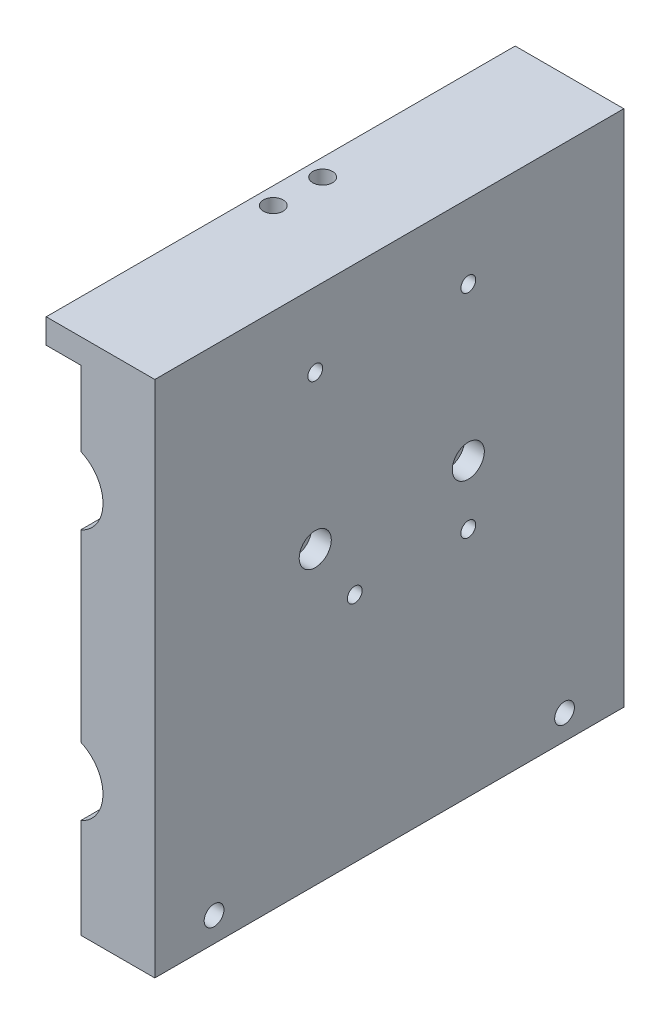
ISO-10303-21;
HEADER;
FILE_DESCRIPTION(('STEP AP214'),'2;1');
FILE_NAME('part.step','',(''),(''),'','','');
FILE_SCHEMA(('AUTOMOTIVE_DESIGN { 1 0 10303 214 1 1 1 1 }'));
ENDSEC;
DATA;
#1=APPLICATION_CONTEXT('core data for automotive mechanical design processes');
#2=APPLICATION_PROTOCOL_DEFINITION('international standard','automotive_design',2000,#1);
#3=PRODUCT_CONTEXT('',#1,'mechanical');
#4=PRODUCT('Part','Part','',(#3));
#5=PRODUCT_RELATED_PRODUCT_CATEGORY('part','',(#4));
#6=PRODUCT_DEFINITION_FORMATION('','',#4);
#7=PRODUCT_DEFINITION_CONTEXT('part definition',#1,'design');
#8=PRODUCT_DEFINITION('design','',#6,#7);
#9=PRODUCT_DEFINITION_SHAPE('','',#8);
#10=(LENGTH_UNIT() NAMED_UNIT(*) SI_UNIT(.MILLI.,.METRE.));
#11=(NAMED_UNIT(*) PLANE_ANGLE_UNIT() SI_UNIT($,.RADIAN.));
#12=(NAMED_UNIT(*) SI_UNIT($,.STERADIAN.) SOLID_ANGLE_UNIT());
#13=UNCERTAINTY_MEASURE_WITH_UNIT(LENGTH_MEASURE(1.E-05),#10,'distance_accuracy_value','');
#14=(GEOMETRIC_REPRESENTATION_CONTEXT(3) GLOBAL_UNCERTAINTY_ASSIGNED_CONTEXT((#13)) GLOBAL_UNIT_ASSIGNED_CONTEXT((#10,
#11,#12)) REPRESENTATION_CONTEXT('',''));
#15=CARTESIAN_POINT('',(0.,0.,0.));
#16=DIRECTION('',(0.,0.,1.));
#17=DIRECTION('',(1.,0.,0.));
#18=AXIS2_PLACEMENT_3D('',#15,#16,#17);
#19=CARTESIAN_POINT('',(15.0000000000006,-40.9999999999998,31.5));
#20=DIRECTION('',(-1.,0.,0.));
#21=DIRECTION('',(0.,-1.,0.));
#22=AXIS2_PLACEMENT_3D('',#19,#20,#21);
#23=CYLINDRICAL_SURFACE('',#22,2.);
#24=CARTESIAN_POINT('',(11.0000000000006,-40.9999999999998,31.5));
#25=DIRECTION('',(1.,0.,0.));
#26=DIRECTION('',(0.,1.,0.));
#27=AXIS2_PLACEMENT_3D('',#24,#25,#26);
#28=CIRCLE('',#27,2.);
#29=CARTESIAN_POINT('',(11.0000000000006,-38.9999999999998,31.5));
#30=VERTEX_POINT('',#29);
#31=EDGE_CURVE('E230',#30,#30,#28,.F.);
#32=ORIENTED_EDGE('',*,*,#31,.F.);
#33=EDGE_LOOP('',(#32));
#34=FACE_BOUND('',#33,.T.);
#35=CARTESIAN_POINT('',(4.00000000000056,-40.9999999999999,31.5));
#36=DIRECTION('',(-1.,0.,0.));
#37=DIRECTION('',(0.,-1.,0.));
#38=AXIS2_PLACEMENT_3D('',#35,#36,#37);
#39=CIRCLE('',#38,2.);
#40=CARTESIAN_POINT('',(4.00000000000056,-42.9999999999999,31.5));
#41=VERTEX_POINT('',#40);
#42=EDGE_CURVE('E45',#41,#41,#39,.F.);
#43=ORIENTED_EDGE('',*,*,#42,.F.);
#44=EDGE_LOOP('',(#43));
#45=FACE_BOUND('',#44,.T.);
#46=ADVANCED_FACE('F41',(#34,#45),#23,.F.);
#47=CARTESIAN_POINT('',(15.0000000000006,-40.9999999999999,62.5));
#48=DIRECTION('',(-1.,0.,0.));
#49=DIRECTION('',(0.,-1.,0.));
#50=AXIS2_PLACEMENT_3D('',#47,#48,#49);
#51=CYLINDRICAL_SURFACE('',#50,2.);
#52=CARTESIAN_POINT('',(11.0000000000006,-40.9999999999999,62.5));
#53=DIRECTION('',(1.,0.,0.));
#54=DIRECTION('',(0.,1.,0.));
#55=AXIS2_PLACEMENT_3D('',#52,#53,#54);
#56=CIRCLE('',#55,2.);
#57=CARTESIAN_POINT('',(11.0000000000006,-38.9999999999999,62.5));
#58=VERTEX_POINT('',#57);
#59=EDGE_CURVE('E226',#58,#58,#56,.F.);
#60=ORIENTED_EDGE('',*,*,#59,.F.);
#61=EDGE_LOOP('',(#60));
#62=FACE_BOUND('',#61,.T.);
#63=CARTESIAN_POINT('',(4.00000000000056,-41.,62.5));
#64=DIRECTION('',(-1.,0.,0.));
#65=DIRECTION('',(0.,-1.,0.));
#66=AXIS2_PLACEMENT_3D('',#63,#64,#65);
#67=CIRCLE('',#66,2.);
#68=CARTESIAN_POINT('',(4.00000000000056,-43.,62.5));
#69=VERTEX_POINT('',#68);
#70=EDGE_CURVE('E245',#69,#69,#67,.F.);
#71=ORIENTED_EDGE('',*,*,#70,.F.);
#72=EDGE_LOOP('',(#71));
#73=FACE_BOUND('',#72,.T.);
#74=ADVANCED_FACE('F430',(#62,#73),#51,.F.);
#75=CARTESIAN_POINT('',(-6.99999999999945,-53.,54.5));
#76=DIRECTION('',(1.,0.,0.));
#77=DIRECTION('',(0.,1.,0.));
#78=AXIS2_PLACEMENT_3D('',#75,#76,#77);
#79=CYLINDRICAL_SURFACE('',#78,1.5);
#80=CARTESIAN_POINT('',(15.0000000000006,-52.9999999999999,54.5));
#81=DIRECTION('',(1.,0.,0.));
#82=DIRECTION('',(0.,1.,0.));
#83=AXIS2_PLACEMENT_3D('',#80,#81,#82);
#84=CIRCLE('',#83,1.5);
#85=CARTESIAN_POINT('',(15.0000000000006,-51.4999999999999,54.5));
#86=VERTEX_POINT('',#85);
#87=EDGE_CURVE('E360',#86,#86,#84,.T.);
#88=ORIENTED_EDGE('',*,*,#87,.T.);
#89=EDGE_LOOP('',(#88));
#90=FACE_BOUND('',#89,.T.);
#91=CARTESIAN_POINT('',(5.00000000000056,-53.,54.5));
#92=DIRECTION('',(-1.,0.,0.));
#93=DIRECTION('',(0.,-1.,0.));
#94=AXIS2_PLACEMENT_3D('',#91,#92,#93);
#95=CIRCLE('',#94,1.5);
#96=CARTESIAN_POINT('',(5.00000000000056,-54.5,54.5));
#97=VERTEX_POINT('',#96);
#98=EDGE_CURVE('E240',#97,#97,#95,.F.);
#99=ORIENTED_EDGE('',*,*,#98,.F.);
#100=EDGE_LOOP('',(#99));
#101=FACE_BOUND('',#100,.T.);
#102=ADVANCED_FACE('F368',(#90,#101),#79,.F.);
#103=CARTESIAN_POINT('',(-6.99999999999945,-52.9999999999999,31.5));
#104=DIRECTION('',(1.,0.,0.));
#105=DIRECTION('',(0.,1.,0.));
#106=AXIS2_PLACEMENT_3D('',#103,#104,#105);
#107=CYLINDRICAL_SURFACE('',#106,1.5);
#108=CARTESIAN_POINT('',(15.0000000000006,-52.9999999999999,31.5));
#109=DIRECTION('',(1.,0.,0.));
#110=DIRECTION('',(0.,1.,0.));
#111=AXIS2_PLACEMENT_3D('',#108,#109,#110);
#112=CIRCLE('',#111,1.5);
#113=CARTESIAN_POINT('',(15.0000000000006,-51.4999999999999,31.5));
#114=VERTEX_POINT('',#113);
#115=EDGE_CURVE('E225',#114,#114,#112,.T.);
#116=ORIENTED_EDGE('',*,*,#115,.T.);
#117=EDGE_LOOP('',(#116));
#118=FACE_BOUND('',#117,.T.);
#119=CARTESIAN_POINT('',(5.00000000000056,-52.9999999999999,31.5));
#120=DIRECTION('',(-1.,0.,0.));
#121=DIRECTION('',(0.,-1.,0.));
#122=AXIS2_PLACEMENT_3D('',#119,#120,#121);
#123=CIRCLE('',#122,1.5);
#124=CARTESIAN_POINT('',(5.00000000000056,-54.4999999999998,31.5));
#125=VERTEX_POINT('',#124);
#126=EDGE_CURVE('E236',#125,#125,#123,.F.);
#127=ORIENTED_EDGE('',*,*,#126,.F.);
#128=EDGE_LOOP('',(#127));
#129=FACE_BOUND('',#128,.T.);
#130=ADVANCED_FACE('F531',(#118,#129),#107,.F.);
#131=CARTESIAN_POINT('',(0.,-37.75,95.));
#132=DIRECTION('',(1.,0.,0.));
#133=DIRECTION('',(0.,1.,0.));
#134=AXIS2_PLACEMENT_3D('',#131,#132,#133);
#135=PLANE('',#134);
#136=CARTESIAN_POINT('',(5.55111512312578E-13,-41.,62.5000000000001));
#137=DIRECTION('',(-1.,0.,0.));
#138=DIRECTION('',(0.,-1.,0.));
#139=AXIS2_PLACEMENT_3D('',#136,#137,#138);
#140=CIRCLE('',#139,3.00000000000001);
#141=CARTESIAN_POINT('',(5.56865375533792E-13,-44.,62.5000000000001));
#142=VERTEX_POINT('',#141);
#143=EDGE_CURVE('E257',#142,#142,#140,.T.);
#144=ORIENTED_EDGE('',*,*,#143,.F.);
#145=EDGE_LOOP('',(#144));
#146=FACE_BOUND('',#145,.T.);
#147=CARTESIAN_POINT('',(5.55111512312578E-13,-40.9999999999999,31.5));
#148=DIRECTION('',(-1.,0.,0.));
#149=DIRECTION('',(0.,-1.,0.));
#150=AXIS2_PLACEMENT_3D('',#147,#148,#149);
#151=CIRCLE('',#150,3.);
#152=CARTESIAN_POINT('',(5.56865375533792E-13,-43.9999999999999,31.5));
#153=VERTEX_POINT('',#152);
#154=EDGE_CURVE('E270',#153,#153,#151,.T.);
#155=ORIENTED_EDGE('',*,*,#154,.F.);
#156=EDGE_LOOP('',(#155));
#157=FACE_BOUND('',#156,.T.);
#158=CARTESIAN_POINT('',(5.55111512312578E-13,-53.,54.5));
#159=DIRECTION('',(-1.,0.,0.));
#160=DIRECTION('',(0.,-1.,0.));
#161=AXIS2_PLACEMENT_3D('',#158,#159,#160);
#162=CIRCLE('',#161,2.5);
#163=CARTESIAN_POINT('',(5.56805452793147E-13,-55.5,54.5));
#164=VERTEX_POINT('',#163);
#165=EDGE_CURVE('E277',#164,#164,#162,.T.);
#166=ORIENTED_EDGE('',*,*,#165,.F.);
#167=EDGE_LOOP('',(#166));
#168=FACE_BOUND('',#167,.T.);
#169=CARTESIAN_POINT('',(5.55111512312578E-13,-52.9999999999999,31.5));
#170=DIRECTION('',(-1.,0.,0.));
#171=DIRECTION('',(0.,-1.,0.));
#172=AXIS2_PLACEMENT_3D('',#169,#170,#171);
#173=CIRCLE('',#172,2.5);
#174=CARTESIAN_POINT('',(5.56805452793147E-13,-55.4999999999999,31.5));
#175=VERTEX_POINT('',#174);
#176=EDGE_CURVE('E255',#175,#175,#173,.T.);
#177=ORIENTED_EDGE('',*,*,#176,.F.);
#178=EDGE_LOOP('',(#177));
#179=FACE_BOUND('',#178,.T.);
#180=DIRECTION('',(0.,-1.,0.));
#181=VECTOR('',#180,1.);
#182=CARTESIAN_POINT('',(0.,2.77555756156289E-13,95.0000000000001));
#183=LINE('',#182,#181);
#184=CARTESIAN_POINT('',(0.,-28.8738635424337,95.0000000000001));
#185=VERTEX_POINT('',#184);
#186=CARTESIAN_POINT('',(5.55111512312578E-13,-66.1261364575662,95.));
#187=VERTEX_POINT('',#186);
#188=EDGE_CURVE('E135',#185,#187,#183,.T.);
#189=ORIENTED_EDGE('',*,*,#188,.F.);
#190=DIRECTION('',(0.,0.,-1.));
#191=VECTOR('',#190,1.);
#192=CARTESIAN_POINT('',(0.,-28.8738635424337,95.0000000000001));
#193=LINE('',#192,#191);
#194=CARTESIAN_POINT('',(0.,-28.8738635424336,0.));
#195=VERTEX_POINT('',#194);
#196=EDGE_CURVE('E313',#185,#195,#193,.T.);
#197=ORIENTED_EDGE('',*,*,#196,.T.);
#198=DIRECTION('',(0.,-1.,0.));
#199=VECTOR('',#198,1.);
#200=CARTESIAN_POINT('',(0.,-37.7499999999999,0.));
#201=LINE('',#200,#199);
#202=CARTESIAN_POINT('',(0.,-66.1261364575661,0.));
#203=VERTEX_POINT('',#202);
#204=EDGE_CURVE('E137',#195,#203,#201,.T.);
#205=ORIENTED_EDGE('',*,*,#204,.T.);
#206=DIRECTION('',(0.,0.,-1.));
#207=VECTOR('',#206,1.);
#208=CARTESIAN_POINT('',(5.55111512312578E-13,-66.1261364575662,95.));
#209=LINE('',#208,#207);
#210=EDGE_CURVE('E59',#203,#187,#209,.F.);
#211=ORIENTED_EDGE('',*,*,#210,.T.);
#212=EDGE_LOOP('',(#189,#197,#205,#211));
#213=FACE_BOUND('',#212,.T.);
#214=ADVANCED_FACE('F133',(#146,#157,#168,#179,#213),#135,.F.);
#215=CARTESIAN_POINT('',(0.,-94.9999999999998,12.));
#216=DIRECTION('',(1.,0.,0.));
#217=DIRECTION('',(0.,1.,0.));
#218=AXIS2_PLACEMENT_3D('',#215,#216,#217);
#219=CIRCLE('',#218,2.);
#220=CARTESIAN_POINT('',(0.,-92.9999999999998,12.));
#221=VERTEX_POINT('',#220);
#222=EDGE_CURVE('E321',#221,#221,#219,.T.);
#223=ORIENTED_EDGE('',*,*,#222,.T.);
#224=EDGE_LOOP('',(#223));
#225=FACE_BOUND('',#224,.T.);
#226=CARTESIAN_POINT('',(5.55111512312578E-13,-94.9999999999999,83.0000000000002));
#227=DIRECTION('',(1.,0.,0.));
#228=DIRECTION('',(0.,1.,0.));
#229=AXIS2_PLACEMENT_3D('',#226,#227,#228);
#230=CIRCLE('',#229,2.);
#231=CARTESIAN_POINT('',(5.53942270165103E-13,-92.9999999999999,83.0000000000002));
#232=VERTEX_POINT('',#231);
#233=EDGE_CURVE('E328',#232,#232,#230,.T.);
#234=ORIENTED_EDGE('',*,*,#233,.T.);
#235=EDGE_LOOP('',(#234));
#236=FACE_BOUND('',#235,.T.);
#237=CARTESIAN_POINT('',(5.55111512312578E-13,-79.8738635424338,95.));
#238=VERTEX_POINT('',#237);
#239=CARTESIAN_POINT('',(5.55111512312578E-13,-100.,95.0000000000001));
#240=VERTEX_POINT('',#239);
#241=EDGE_CURVE('E146',#238,#240,#183,.T.);
#242=ORIENTED_EDGE('',*,*,#241,.F.);
#243=DIRECTION('',(0.,0.,-1.));
#244=VECTOR('',#243,1.);
#245=CARTESIAN_POINT('',(5.55111512312578E-13,-79.8738635424338,95.));
#246=LINE('',#245,#244);
#247=CARTESIAN_POINT('',(0.,-79.8738635424336,0.));
#248=VERTEX_POINT('',#247);
#249=EDGE_CURVE('E122',#238,#248,#246,.T.);
#250=ORIENTED_EDGE('',*,*,#249,.T.);
#251=CARTESIAN_POINT('',(0.,-99.9999999999998,0.));
#252=VERTEX_POINT('',#251);
#253=EDGE_CURVE('E172',#248,#252,#201,.T.);
#254=ORIENTED_EDGE('',*,*,#253,.T.);
#255=DIRECTION('',(0.,0.,-1.));
#256=VECTOR('',#255,1.);
#257=CARTESIAN_POINT('',(5.55111512312578E-13,-100.,95.0000000000001));
#258=LINE('',#257,#256);
#259=EDGE_CURVE('E51',#240,#252,#258,.T.);
#260=ORIENTED_EDGE('',*,*,#259,.F.);
#261=EDGE_LOOP('',(#242,#250,#254,#260));
#262=FACE_BOUND('',#261,.T.);
#263=ADVANCED_FACE('F419',(#225,#236,#262),#135,.F.);
#264=CARTESIAN_POINT('',(-6.99999999999945,-10.,31.5));
#265=DIRECTION('',(1.,0.,0.));
#266=DIRECTION('',(0.,1.,0.));
#267=AXIS2_PLACEMENT_3D('',#264,#265,#266);
#268=CYLINDRICAL_SURFACE('',#267,1.5);
#269=CARTESIAN_POINT('',(15.0000000000006,-10.,31.5));
#270=DIRECTION('',(1.,0.,0.));
#271=DIRECTION('',(0.,1.,0.));
#272=AXIS2_PLACEMENT_3D('',#269,#270,#271);
#273=CIRCLE('',#272,1.5);
#274=CARTESIAN_POINT('',(15.0000000000006,-8.50000000000001,31.5));
#275=VERTEX_POINT('',#274);
#276=EDGE_CURVE('E356',#275,#275,#273,.T.);
#277=ORIENTED_EDGE('',*,*,#276,.T.);
#278=EDGE_LOOP('',(#277));
#279=FACE_BOUND('',#278,.T.);
#280=CARTESIAN_POINT('',(3.00000000000056,-10.,31.5000000000001));
#281=DIRECTION('',(-1.,0.,0.));
#282=DIRECTION('',(0.,-1.,0.));
#283=AXIS2_PLACEMENT_3D('',#280,#281,#282);
#284=CIRCLE('',#283,1.5);
#285=CARTESIAN_POINT('',(3.00000000000056,-11.5,31.5000000000001));
#286=VERTEX_POINT('',#285);
#287=EDGE_CURVE('E212',#286,#286,#284,.F.);
#288=ORIENTED_EDGE('',*,*,#287,.F.);
#289=EDGE_LOOP('',(#288));
#290=FACE_BOUND('',#289,.T.);
#291=ADVANCED_FACE('F471',(#279,#290),#268,.F.);
#292=CARTESIAN_POINT('',(-6.99999999999945,-9.99999999999973,62.5000000000001));
#293=DIRECTION('',(1.,0.,0.));
#294=DIRECTION('',(0.,1.,0.));
#295=AXIS2_PLACEMENT_3D('',#292,#293,#294);
#296=CYLINDRICAL_SURFACE('',#295,1.5);
#297=CARTESIAN_POINT('',(15.0000000000006,-9.99999999999973,62.5));
#298=DIRECTION('',(1.,0.,0.));
#299=DIRECTION('',(0.,1.,0.));
#300=AXIS2_PLACEMENT_3D('',#297,#298,#299);
#301=CIRCLE('',#300,1.5);
#302=CARTESIAN_POINT('',(15.0000000000006,-8.49999999999974,62.5));
#303=VERTEX_POINT('',#302);
#304=EDGE_CURVE('E173',#303,#303,#301,.T.);
#305=ORIENTED_EDGE('',*,*,#304,.T.);
#306=EDGE_LOOP('',(#305));
#307=FACE_BOUND('',#306,.T.);
#308=CARTESIAN_POINT('',(3.00000000000056,-9.99999999999973,62.5));
#309=DIRECTION('',(-1.,0.,0.));
#310=DIRECTION('',(0.,-1.,0.));
#311=AXIS2_PLACEMENT_3D('',#308,#309,#310);
#312=CIRCLE('',#311,1.5);
#313=CARTESIAN_POINT('',(3.00000000000056,-11.4999999999997,62.5));
#314=VERTEX_POINT('',#313);
#315=EDGE_CURVE('E208',#314,#314,#312,.F.);
#316=ORIENTED_EDGE('',*,*,#315,.F.);
#317=EDGE_LOOP('',(#316));
#318=FACE_BOUND('',#317,.T.);
#319=ADVANCED_FACE('F466',(#307,#318),#296,.F.);
#320=CARTESIAN_POINT('',(-7.00000000000001,2.77555756156289E-13,95.0000000000001));
#321=DIRECTION('',(0.,1.,0.));
#322=DIRECTION('',(0.,0.,1.));
#323=AXIS2_PLACEMENT_3D('',#320,#321,#322);
#324=PLANE('',#323);
#325=CARTESIAN_POINT('',(-3.4999999999995,2.77555756156289E-13,52.5000000000001));
#326=DIRECTION('',(0.,-1.,0.));
#327=DIRECTION('',(0.,0.,-1.));
#328=AXIS2_PLACEMENT_3D('',#325,#326,#327);
#329=CIRCLE('',#328,2.);
#330=CARTESIAN_POINT('',(-3.4999999999995,2.77555756156289E-13,50.5000000000001));
#331=VERTEX_POINT('',#330);
#332=EDGE_CURVE('E292',#331,#331,#329,.T.);
#333=ORIENTED_EDGE('',*,*,#332,.F.);
#334=EDGE_LOOP('',(#333));
#335=FACE_BOUND('',#334,.T.);
#336=CARTESIAN_POINT('',(-3.4999999999995,2.77555756156289E-13,42.5));
#337=DIRECTION('',(0.,-1.,0.));
#338=DIRECTION('',(0.,0.,-1.));
#339=AXIS2_PLACEMENT_3D('',#336,#337,#338);
#340=CIRCLE('',#339,2.);
#341=CARTESIAN_POINT('',(-3.4999999999995,2.77555756156289E-13,40.5));
#342=VERTEX_POINT('',#341);
#343=EDGE_CURVE('E244',#342,#342,#340,.T.);
#344=ORIENTED_EDGE('',*,*,#343,.F.);
#345=EDGE_LOOP('',(#344));
#346=FACE_BOUND('',#345,.T.);
#347=DIRECTION('',(1.,0.,0.));
#348=VECTOR('',#347,1.);
#349=CARTESIAN_POINT('',(-7.00000000000001,0.,0.));
#350=LINE('',#349,#348);
#351=CARTESIAN_POINT('',(-7.00000000000001,0.,0.));
#352=VERTEX_POINT('',#351);
#353=CARTESIAN_POINT('',(0.,0.,0.));
#354=VERTEX_POINT('',#353);
#355=EDGE_CURVE('E168',#352,#354,#350,.T.);
#356=ORIENTED_EDGE('',*,*,#355,.T.);
#357=DIRECTION('',(0.,0.,-1.));
#358=VECTOR('',#357,1.);
#359=CARTESIAN_POINT('',(0.,2.77555756156289E-13,95.0000000000001));
#360=LINE('',#359,#358);
#361=CARTESIAN_POINT('',(0.,2.77555756156289E-13,95.0000000000001));
#362=VERTEX_POINT('',#361);
#363=EDGE_CURVE('E11',#362,#354,#360,.T.);
#364=ORIENTED_EDGE('',*,*,#363,.F.);
#365=DIRECTION('',(1.,0.,0.));
#366=VECTOR('',#365,1.);
#367=CARTESIAN_POINT('',(-7.00000000000001,2.77555756156289E-13,95.0000000000001));
#368=LINE('',#367,#366);
#369=CARTESIAN_POINT('',(-7.00000000000001,2.77555756156289E-13,95.0000000000001));
#370=VERTEX_POINT('',#369);
#371=EDGE_CURVE('E152',#370,#362,#368,.T.);
#372=ORIENTED_EDGE('',*,*,#371,.F.);
#373=DIRECTION('',(0.,0.,-1.));
#374=VECTOR('',#373,1.);
#375=CARTESIAN_POINT('',(-7.00000000000001,2.77555756156289E-13,95.0000000000001));
#376=LINE('',#375,#374);
#377=EDGE_CURVE('E167',#370,#352,#376,.T.);
#378=ORIENTED_EDGE('',*,*,#377,.T.);
#379=EDGE_LOOP('',(#356,#364,#372,#378));
#380=FACE_BOUND('',#379,.T.);
#381=ADVANCED_FACE('F43',(#335,#346,#380),#324,.F.);
#382=CARTESIAN_POINT('',(5.55111512312578E-13,-9.99999999999973,62.5000000000001));
#383=DIRECTION('',(1.,0.,0.));
#384=DIRECTION('',(0.,1.,0.));
#385=AXIS2_PLACEMENT_3D('',#382,#383,#384);
#386=CIRCLE('',#385,2.5);
#387=CARTESIAN_POINT('',(5.53649959628234E-13,-7.49999999999973,62.5000000000001));
#388=VERTEX_POINT('',#387);
#389=EDGE_CURVE('E221',#388,#388,#386,.F.);
#390=ORIENTED_EDGE('',*,*,#389,.F.);
#391=EDGE_LOOP('',(#390));
#392=FACE_BOUND('',#391,.T.);
#393=CARTESIAN_POINT('',(5.55111512312578E-13,-10.,31.5000000000001));
#394=DIRECTION('',(1.,0.,0.));
#395=DIRECTION('',(0.,1.,0.));
#396=AXIS2_PLACEMENT_3D('',#393,#394,#395);
#397=CIRCLE('',#396,2.50000000000001);
#398=CARTESIAN_POINT('',(5.53649959628234E-13,-7.5,31.5000000000001));
#399=VERTEX_POINT('',#398);
#400=EDGE_CURVE('E217',#399,#399,#397,.F.);
#401=ORIENTED_EDGE('',*,*,#400,.F.);
#402=EDGE_LOOP('',(#401));
#403=FACE_BOUND('',#402,.T.);
#404=CARTESIAN_POINT('',(0.,-15.1261364575662,0.));
#405=VERTEX_POINT('',#404);
#406=EDGE_CURVE('E174',#354,#405,#201,.T.);
#407=ORIENTED_EDGE('',*,*,#406,.T.);
#408=DIRECTION('',(0.,0.,-1.));
#409=VECTOR('',#408,1.);
#410=CARTESIAN_POINT('',(0.,-15.126136457566,95.0000000000001));
#411=LINE('',#410,#409);
#412=CARTESIAN_POINT('',(0.,-15.1261364575659,95.0000000000001));
#413=VERTEX_POINT('',#412);
#414=EDGE_CURVE('E67',#405,#413,#411,.F.);
#415=ORIENTED_EDGE('',*,*,#414,.T.);
#416=EDGE_CURVE('E145',#362,#413,#183,.T.);
#417=ORIENTED_EDGE('',*,*,#416,.F.);
#418=ORIENTED_EDGE('',*,*,#363,.T.);
#419=EDGE_LOOP('',(#407,#415,#417,#418));
#420=FACE_BOUND('',#419,.T.);
#421=ADVANCED_FACE('F423',(#392,#403,#420),#135,.F.);
#422=CARTESIAN_POINT('',(5.55111512312578E-13,-100.,95.0000000000001));
#423=DIRECTION('',(0.,1.,0.));
#424=DIRECTION('',(0.,0.,1.));
#425=AXIS2_PLACEMENT_3D('',#422,#423,#424);
#426=PLANE('',#425);
#427=DIRECTION('',(1.,0.,0.));
#428=VECTOR('',#427,1.);
#429=CARTESIAN_POINT('',(0.,-99.9999999999998,0.));
#430=LINE('',#429,#428);
#431=CARTESIAN_POINT('',(15.,-99.9999999999998,0.));
#432=VERTEX_POINT('',#431);
#433=EDGE_CURVE('E178',#252,#432,#430,.T.);
#434=ORIENTED_EDGE('',*,*,#433,.T.);
#435=DIRECTION('',(0.,0.,-1.));
#436=VECTOR('',#435,1.);
#437=CARTESIAN_POINT('',(15.0000000000006,-100.,95.));
#438=LINE('',#437,#436);
#439=CARTESIAN_POINT('',(15.0000000000006,-100.,95.));
#440=VERTEX_POINT('',#439);
#441=EDGE_CURVE('E201',#440,#432,#438,.T.);
#442=ORIENTED_EDGE('',*,*,#441,.F.);
#443=DIRECTION('',(1.,0.,0.));
#444=VECTOR('',#443,1.);
#445=CARTESIAN_POINT('',(5.55111512312578E-13,-100.,95.0000000000001));
#446=LINE('',#445,#444);
#447=EDGE_CURVE('E151',#240,#440,#446,.T.);
#448=ORIENTED_EDGE('',*,*,#447,.F.);
#449=ORIENTED_EDGE('',*,*,#259,.T.);
#450=EDGE_LOOP('',(#434,#442,#448,#449));
#451=FACE_BOUND('',#450,.T.);
#452=ADVANCED_FACE('F375',(#451),#426,.F.);
#453=CARTESIAN_POINT('',(15.0000000000006,-100.,95.));
#454=DIRECTION('',(-1.,0.,0.));
#455=DIRECTION('',(0.,0.,1.));
#456=AXIS2_PLACEMENT_3D('',#453,#454,#455);
#457=PLANE('',#456);
#458=CARTESIAN_POINT('',(15.0000000000006,-94.9999999999999,83.));
#459=DIRECTION('',(1.,0.,0.));
#460=DIRECTION('',(0.,1.,0.));
#461=AXIS2_PLACEMENT_3D('',#458,#459,#460);
#462=CIRCLE('',#461,2.);
#463=CARTESIAN_POINT('',(15.0000000000006,-92.9999999999999,83.));
#464=VERTEX_POINT('',#463);
#465=EDGE_CURVE('E317',#464,#464,#462,.T.);
#466=ORIENTED_EDGE('',*,*,#465,.F.);
#467=EDGE_LOOP('',(#466));
#468=FACE_BOUND('',#467,.T.);
#469=CARTESIAN_POINT('',(15.,-94.9999999999998,12.));
#470=DIRECTION('',(1.,0.,0.));
#471=DIRECTION('',(0.,1.,0.));
#472=AXIS2_PLACEMENT_3D('',#469,#470,#471);
#473=CIRCLE('',#472,2.);
#474=CARTESIAN_POINT('',(15.,-92.9999999999998,12.));
#475=VERTEX_POINT('',#474);
#476=EDGE_CURVE('E316',#475,#475,#473,.T.);
#477=ORIENTED_EDGE('',*,*,#476,.F.);
#478=EDGE_LOOP('',(#477));
#479=FACE_BOUND('',#478,.T.);
#480=CARTESIAN_POINT('',(15.0000000000006,-40.9999999999998,31.5));
#481=DIRECTION('',(1.,0.,0.));
#482=DIRECTION('',(0.,1.,0.));
#483=AXIS2_PLACEMENT_3D('',#480,#481,#482);
#484=CIRCLE('',#483,3.25);
#485=CARTESIAN_POINT('',(15.0000000000006,-37.7499999999998,31.5));
#486=VERTEX_POINT('',#485);
#487=EDGE_CURVE('E336',#486,#486,#484,.T.);
#488=ORIENTED_EDGE('',*,*,#487,.F.);
#489=EDGE_LOOP('',(#488));
#490=FACE_BOUND('',#489,.T.);
#491=CARTESIAN_POINT('',(15.0000000000006,-40.9999999999999,62.5));
#492=DIRECTION('',(1.,0.,0.));
#493=DIRECTION('',(0.,1.,0.));
#494=AXIS2_PLACEMENT_3D('',#491,#492,#493);
#495=CIRCLE('',#494,3.25000000000001);
#496=CARTESIAN_POINT('',(15.0000000000006,-37.7499999999999,62.5));
#497=VERTEX_POINT('',#496);
#498=EDGE_CURVE('E332',#497,#497,#495,.T.);
#499=ORIENTED_EDGE('',*,*,#498,.F.);
#500=EDGE_LOOP('',(#499));
#501=FACE_BOUND('',#500,.T.);
#502=ORIENTED_EDGE('',*,*,#304,.F.);
#503=EDGE_LOOP('',(#502));
#504=FACE_BOUND('',#503,.T.);
#505=ORIENTED_EDGE('',*,*,#115,.F.);
#506=EDGE_LOOP('',(#505));
#507=FACE_BOUND('',#506,.T.);
#508=ORIENTED_EDGE('',*,*,#87,.F.);
#509=EDGE_LOOP('',(#508));
#510=FACE_BOUND('',#509,.T.);
#511=ORIENTED_EDGE('',*,*,#276,.F.);
#512=EDGE_LOOP('',(#511));
#513=FACE_BOUND('',#512,.T.);
#514=DIRECTION('',(0.,1.,0.));
#515=VECTOR('',#514,1.);
#516=CARTESIAN_POINT('',(15.,-99.9999999999998,0.));
#517=LINE('',#516,#515);
#518=CARTESIAN_POINT('',(15.,5.,0.));
#519=VERTEX_POINT('',#518);
#520=EDGE_CURVE('E181',#432,#519,#517,.T.);
#521=ORIENTED_EDGE('',*,*,#520,.T.);
#522=DIRECTION('',(0.,0.,-1.));
#523=VECTOR('',#522,1.);
#524=CARTESIAN_POINT('',(15.,5.00000000000028,95.));
#525=LINE('',#524,#523);
#526=CARTESIAN_POINT('',(15.,5.00000000000028,95.));
#527=VERTEX_POINT('',#526);
#528=EDGE_CURVE('E197',#527,#519,#525,.T.);
#529=ORIENTED_EDGE('',*,*,#528,.F.);
#530=DIRECTION('',(0.,1.,0.));
#531=VECTOR('',#530,1.);
#532=CARTESIAN_POINT('',(15.0000000000006,-100.,95.));
#533=LINE('',#532,#531);
#534=EDGE_CURVE('E158',#440,#527,#533,.T.);
#535=ORIENTED_EDGE('',*,*,#534,.F.);
#536=ORIENTED_EDGE('',*,*,#441,.T.);
#537=EDGE_LOOP('',(#521,#529,#535,#536));
#538=FACE_BOUND('',#537,.T.);
#539=ADVANCED_FACE('F371',(#468,#479,#490,#501,#504,#507,#510,#513,#538),#457,.F.);
#540=CARTESIAN_POINT('',(15.,5.00000000000028,95.));
#541=DIRECTION('',(0.,-1.,0.));
#542=DIRECTION('',(1.,0.,0.));
#543=AXIS2_PLACEMENT_3D('',#540,#541,#542);
#544=PLANE('',#543);
#545=CARTESIAN_POINT('',(-3.4999999999995,5.00000000000028,52.5000000000001));
#546=DIRECTION('',(0.,-1.,0.));
#547=DIRECTION('',(0.,0.,-1.));
#548=AXIS2_PLACEMENT_3D('',#545,#546,#547);
#549=CIRCLE('',#548,2.);
#550=CARTESIAN_POINT('',(-3.4999999999995,5.00000000000028,50.5000000000001));
#551=VERTEX_POINT('',#550);
#552=EDGE_CURVE('E288',#551,#551,#549,.T.);
#553=ORIENTED_EDGE('',*,*,#552,.T.);
#554=EDGE_LOOP('',(#553));
#555=FACE_BOUND('',#554,.T.);
#556=CARTESIAN_POINT('',(-3.4999999999995,5.00000000000028,42.5));
#557=DIRECTION('',(0.,-1.,0.));
#558=DIRECTION('',(0.,0.,-1.));
#559=AXIS2_PLACEMENT_3D('',#556,#557,#558);
#560=CIRCLE('',#559,2.);
#561=CARTESIAN_POINT('',(-3.4999999999995,5.00000000000028,40.5));
#562=VERTEX_POINT('',#561);
#563=EDGE_CURVE('E296',#562,#562,#560,.T.);
#564=ORIENTED_EDGE('',*,*,#563,.T.);
#565=EDGE_LOOP('',(#564));
#566=FACE_BOUND('',#565,.T.);
#567=DIRECTION('',(-1.,0.,0.));
#568=VECTOR('',#567,1.);
#569=CARTESIAN_POINT('',(15.,5.,0.));
#570=LINE('',#569,#568);
#571=CARTESIAN_POINT('',(-7.00000000000001,5.,0.));
#572=VERTEX_POINT('',#571);
#573=EDGE_CURVE('E184',#519,#572,#570,.T.);
#574=ORIENTED_EDGE('',*,*,#573,.T.);
#575=DIRECTION('',(0.,0.,-1.));
#576=VECTOR('',#575,1.);
#577=CARTESIAN_POINT('',(-7.00000000000001,5.00000000000023,95.0000000000001));
#578=LINE('',#577,#576);
#579=CARTESIAN_POINT('',(-7.00000000000001,5.00000000000023,95.0000000000001));
#580=VERTEX_POINT('',#579);
#581=EDGE_CURVE('E193',#580,#572,#578,.T.);
#582=ORIENTED_EDGE('',*,*,#581,.F.);
#583=DIRECTION('',(-1.,0.,0.));
#584=VECTOR('',#583,1.);
#585=CARTESIAN_POINT('',(15.,5.00000000000028,95.));
#586=LINE('',#585,#584);
#587=EDGE_CURVE('E161',#527,#580,#586,.T.);
#588=ORIENTED_EDGE('',*,*,#587,.F.);
#589=ORIENTED_EDGE('',*,*,#528,.T.);
#590=EDGE_LOOP('',(#574,#582,#588,#589));
#591=FACE_BOUND('',#590,.T.);
#592=ADVANCED_FACE('F374',(#555,#566,#591),#544,.F.);
#593=CARTESIAN_POINT('',(-7.00000000000001,5.00000000000023,95.0000000000001));
#594=DIRECTION('',(1.,0.,0.));
#595=DIRECTION('',(0.,1.,0.));
#596=AXIS2_PLACEMENT_3D('',#593,#594,#595);
#597=PLANE('',#596);
#598=DIRECTION('',(0.,-1.,0.));
#599=VECTOR('',#598,1.);
#600=CARTESIAN_POINT('',(-7.00000000000001,5.,0.));
#601=LINE('',#600,#599);
#602=EDGE_CURVE('E187',#572,#352,#601,.T.);
#603=ORIENTED_EDGE('',*,*,#602,.T.);
#604=ORIENTED_EDGE('',*,*,#377,.F.);
#605=DIRECTION('',(0.,-1.,0.));
#606=VECTOR('',#605,1.);
#607=CARTESIAN_POINT('',(-7.00000000000001,5.00000000000023,95.0000000000001));
#608=LINE('',#607,#606);
#609=EDGE_CURVE('E164',#580,#370,#608,.T.);
#610=ORIENTED_EDGE('',*,*,#609,.F.);
#611=ORIENTED_EDGE('',*,*,#581,.T.);
#612=EDGE_LOOP('',(#603,#604,#610,#611));
#613=FACE_BOUND('',#612,.T.);
#614=ADVANCED_FACE('F395',(#613),#597,.F.);
#615=CARTESIAN_POINT('',(0.,2.77555756156289E-13,95.0000000000001));
#616=DIRECTION('',(0.,0.,-1.));
#617=DIRECTION('',(-1.,0.,0.));
#618=AXIS2_PLACEMENT_3D('',#615,#616,#617);
#619=PLANE('',#618);
#620=ORIENTED_EDGE('',*,*,#416,.T.);
#621=CARTESIAN_POINT('',(-2.99999999999989,-21.9999999999997,95.));
#622=DIRECTION('',(0.,0.,-1.));
#623=DIRECTION('',(-1.,0.,0.));
#624=AXIS2_PLACEMENT_3D('',#621,#622,#623);
#625=CIRCLE('',#624,7.5);
#626=EDGE_CURVE('E139',#413,#185,#625,.T.);
#627=ORIENTED_EDGE('',*,*,#626,.T.);
#628=ORIENTED_EDGE('',*,*,#188,.T.);
#629=CARTESIAN_POINT('',(-2.99999999999945,-73.,95.));
#630=DIRECTION('',(0.,0.,-1.));
#631=DIRECTION('',(-1.,0.,0.));
#632=AXIS2_PLACEMENT_3D('',#629,#630,#631);
#633=CIRCLE('',#632,7.5);
#634=EDGE_CURVE('E119',#187,#238,#633,.T.);
#635=ORIENTED_EDGE('',*,*,#634,.T.);
#636=ORIENTED_EDGE('',*,*,#241,.T.);
#637=ORIENTED_EDGE('',*,*,#447,.T.);
#638=ORIENTED_EDGE('',*,*,#534,.T.);
#639=ORIENTED_EDGE('',*,*,#587,.T.);
#640=ORIENTED_EDGE('',*,*,#609,.T.);
#641=ORIENTED_EDGE('',*,*,#371,.T.);
#642=EDGE_LOOP('',(#620,#627,#628,#635,#636,#637,#638,#639,#640,#641));
#643=FACE_BOUND('',#642,.T.);
#644=ADVANCED_FACE('F143',(#643),#619,.F.);
#645=CARTESIAN_POINT('',(0.,0.,0.));
#646=DIRECTION('',(0.,0.,-1.));
#647=DIRECTION('',(-1.,0.,0.));
#648=AXIS2_PLACEMENT_3D('',#645,#646,#647);
#649=PLANE('',#648);
#650=CARTESIAN_POINT('',(-3.,-22.,0.));
#651=DIRECTION('',(0.,0.,-1.));
#652=DIRECTION('',(-1.,0.,0.));
#653=AXIS2_PLACEMENT_3D('',#650,#651,#652);
#654=CIRCLE('',#653,7.5);
#655=EDGE_CURVE('E127',#405,#195,#654,.T.);
#656=ORIENTED_EDGE('',*,*,#655,.F.);
#657=ORIENTED_EDGE('',*,*,#406,.F.);
#658=ORIENTED_EDGE('',*,*,#355,.F.);
#659=ORIENTED_EDGE('',*,*,#602,.F.);
#660=ORIENTED_EDGE('',*,*,#573,.F.);
#661=ORIENTED_EDGE('',*,*,#520,.F.);
#662=ORIENTED_EDGE('',*,*,#433,.F.);
#663=ORIENTED_EDGE('',*,*,#253,.F.);
#664=CARTESIAN_POINT('',(-3.,-72.9999999999999,0.));
#665=DIRECTION('',(0.,0.,-1.));
#666=DIRECTION('',(-1.,0.,0.));
#667=AXIS2_PLACEMENT_3D('',#664,#665,#666);
#668=CIRCLE('',#667,7.5);
#669=EDGE_CURVE('E128',#203,#248,#668,.T.);
#670=ORIENTED_EDGE('',*,*,#669,.F.);
#671=ORIENTED_EDGE('',*,*,#204,.F.);
#672=EDGE_LOOP('',(#656,#657,#658,#659,#660,#661,#662,#663,#670,#671));
#673=FACE_BOUND('',#672,.T.);
#674=ADVANCED_FACE('F391',(#673),#649,.T.);
#675=CARTESIAN_POINT('',(-6.99999999999945,-9.99999999999973,62.5000000000001));
#676=DIRECTION('',(1.,0.,0.));
#677=DIRECTION('',(0.,1.,0.));
#678=AXIS2_PLACEMENT_3D('',#675,#676,#677);
#679=CYLINDRICAL_SURFACE('',#678,2.5);
#680=CARTESIAN_POINT('',(3.00000000000056,-9.99999999999973,62.5));
#681=DIRECTION('',(-1.,0.,0.));
#682=DIRECTION('',(0.,-1.,0.));
#683=AXIS2_PLACEMENT_3D('',#680,#681,#682);
#684=CIRCLE('',#683,2.5);
#685=CARTESIAN_POINT('',(3.00000000000056,-12.4999999999997,62.5));
#686=VERTEX_POINT('',#685);
#687=EDGE_CURVE('E213',#686,#686,#684,.T.);
#688=ORIENTED_EDGE('',*,*,#687,.F.);
#689=EDGE_LOOP('',(#688));
#690=FACE_BOUND('',#689,.T.);
#691=ORIENTED_EDGE('',*,*,#389,.T.);
#692=EDGE_LOOP('',(#691));
#693=FACE_BOUND('',#692,.T.);
#694=ADVANCED_FACE('F446',(#690,#693),#679,.F.);
#695=CARTESIAN_POINT('',(3.00000000000056,-9.99999999999973,62.5));
#696=DIRECTION('',(-1.,0.,0.));
#697=DIRECTION('',(0.,-1.,0.));
#698=AXIS2_PLACEMENT_3D('',#695,#696,#697);
#699=PLANE('',#698);
#700=ORIENTED_EDGE('',*,*,#687,.T.);
#701=EDGE_LOOP('',(#700));
#702=FACE_BOUND('',#701,.T.);
#703=ORIENTED_EDGE('',*,*,#315,.T.);
#704=EDGE_LOOP('',(#703));
#705=FACE_BOUND('',#704,.T.);
#706=ADVANCED_FACE('F517',(#702,#705),#699,.T.);
#707=CARTESIAN_POINT('',(-6.99999999999945,-10.,31.5));
#708=DIRECTION('',(1.,0.,0.));
#709=DIRECTION('',(0.,1.,0.));
#710=AXIS2_PLACEMENT_3D('',#707,#708,#709);
#711=CYLINDRICAL_SURFACE('',#710,2.50000000000001);
#712=CARTESIAN_POINT('',(3.00000000000056,-10.,31.5000000000001));
#713=DIRECTION('',(-1.,0.,0.));
#714=DIRECTION('',(0.,-1.,0.));
#715=AXIS2_PLACEMENT_3D('',#712,#713,#714);
#716=CIRCLE('',#715,2.50000000000001);
#717=CARTESIAN_POINT('',(3.00000000000056,-12.5,31.5000000000001));
#718=VERTEX_POINT('',#717);
#719=EDGE_CURVE('E235',#718,#718,#716,.T.);
#720=ORIENTED_EDGE('',*,*,#719,.F.);
#721=EDGE_LOOP('',(#720));
#722=FACE_BOUND('',#721,.T.);
#723=ORIENTED_EDGE('',*,*,#400,.T.);
#724=EDGE_LOOP('',(#723));
#725=FACE_BOUND('',#724,.T.);
#726=ADVANCED_FACE('F520',(#722,#725),#711,.F.);
#727=CARTESIAN_POINT('',(3.00000000000056,-10.,31.5000000000001));
#728=DIRECTION('',(-1.,0.,0.));
#729=DIRECTION('',(0.,-1.,0.));
#730=AXIS2_PLACEMENT_3D('',#727,#728,#729);
#731=PLANE('',#730);
#732=ORIENTED_EDGE('',*,*,#719,.T.);
#733=EDGE_LOOP('',(#732));
#734=FACE_BOUND('',#733,.T.);
#735=ORIENTED_EDGE('',*,*,#287,.T.);
#736=EDGE_LOOP('',(#735));
#737=FACE_BOUND('',#736,.T.);
#738=ADVANCED_FACE('F512',(#734,#737),#731,.T.);
#739=CARTESIAN_POINT('',(11.0000000000006,-40.9999999999999,62.5));
#740=DIRECTION('',(1.,0.,0.));
#741=DIRECTION('',(0.,1.,0.));
#742=AXIS2_PLACEMENT_3D('',#739,#740,#741);
#743=PLANE('',#742);
#744=CARTESIAN_POINT('',(11.0000000000006,-40.9999999999999,62.5));
#745=DIRECTION('',(1.,0.,0.));
#746=DIRECTION('',(0.,1.,0.));
#747=AXIS2_PLACEMENT_3D('',#744,#745,#746);
#748=CIRCLE('',#747,3.25000000000001);
#749=CARTESIAN_POINT('',(11.0000000000006,-37.7499999999999,62.5));
#750=VERTEX_POINT('',#749);
#751=EDGE_CURVE('E340',#750,#750,#748,.T.);
#752=ORIENTED_EDGE('',*,*,#751,.T.);
#753=EDGE_LOOP('',(#752));
#754=FACE_BOUND('',#753,.T.);
#755=ORIENTED_EDGE('',*,*,#59,.T.);
#756=EDGE_LOOP('',(#755));
#757=FACE_BOUND('',#756,.T.);
#758=ADVANCED_FACE('F509',(#754,#757),#743,.T.);
#759=CARTESIAN_POINT('',(11.0000000000006,-40.9999999999999,62.5));
#760=DIRECTION('',(1.,0.,0.));
#761=DIRECTION('',(0.,1.,0.));
#762=AXIS2_PLACEMENT_3D('',#759,#760,#761);
#763=CYLINDRICAL_SURFACE('',#762,3.25000000000001);
#764=ORIENTED_EDGE('',*,*,#751,.F.);
#765=EDGE_LOOP('',(#764));
#766=FACE_BOUND('',#765,.T.);
#767=ORIENTED_EDGE('',*,*,#498,.T.);
#768=EDGE_LOOP('',(#767));
#769=FACE_BOUND('',#768,.T.);
#770=ADVANCED_FACE('F504',(#766,#769),#763,.F.);
#771=CARTESIAN_POINT('',(11.0000000000006,-40.9999999999998,31.5));
#772=DIRECTION('',(1.,0.,0.));
#773=DIRECTION('',(0.,1.,0.));
#774=AXIS2_PLACEMENT_3D('',#771,#772,#773);
#775=PLANE('',#774);
#776=CARTESIAN_POINT('',(11.0000000000006,-40.9999999999998,31.5));
#777=DIRECTION('',(1.,0.,0.));
#778=DIRECTION('',(0.,1.,0.));
#779=AXIS2_PLACEMENT_3D('',#776,#777,#778);
#780=CIRCLE('',#779,3.25);
#781=CARTESIAN_POINT('',(11.0000000000006,-37.7499999999998,31.5));
#782=VERTEX_POINT('',#781);
#783=EDGE_CURVE('E231',#782,#782,#780,.T.);
#784=ORIENTED_EDGE('',*,*,#783,.T.);
#785=EDGE_LOOP('',(#784));
#786=FACE_BOUND('',#785,.T.);
#787=ORIENTED_EDGE('',*,*,#31,.T.);
#788=EDGE_LOOP('',(#787));
#789=FACE_BOUND('',#788,.T.);
#790=ADVANCED_FACE('F501',(#786,#789),#775,.T.);
#791=CARTESIAN_POINT('',(11.0000000000006,-40.9999999999998,31.5));
#792=DIRECTION('',(1.,0.,0.));
#793=DIRECTION('',(0.,1.,0.));
#794=AXIS2_PLACEMENT_3D('',#791,#792,#793);
#795=CYLINDRICAL_SURFACE('',#794,3.25);
#796=ORIENTED_EDGE('',*,*,#783,.F.);
#797=EDGE_LOOP('',(#796));
#798=FACE_BOUND('',#797,.T.);
#799=ORIENTED_EDGE('',*,*,#487,.T.);
#800=EDGE_LOOP('',(#799));
#801=FACE_BOUND('',#800,.T.);
#802=ADVANCED_FACE('F499',(#798,#801),#795,.F.);
#803=CARTESIAN_POINT('',(-7.00000000000001,-94.9999999999998,12.));
#804=DIRECTION('',(1.,0.,0.));
#805=DIRECTION('',(0.,1.,0.));
#806=AXIS2_PLACEMENT_3D('',#803,#804,#805);
#807=CYLINDRICAL_SURFACE('',#806,2.);
#808=ORIENTED_EDGE('',*,*,#476,.T.);
#809=EDGE_LOOP('',(#808));
#810=FACE_BOUND('',#809,.T.);
#811=ORIENTED_EDGE('',*,*,#222,.F.);
#812=EDGE_LOOP('',(#811));
#813=FACE_BOUND('',#812,.T.);
#814=ADVANCED_FACE('F495',(#810,#813),#807,.F.);
#815=CARTESIAN_POINT('',(-6.99999999999945,-94.9999999999999,83.0000000000002));
#816=DIRECTION('',(1.,0.,0.));
#817=DIRECTION('',(0.,1.,0.));
#818=AXIS2_PLACEMENT_3D('',#815,#816,#817);
#819=CYLINDRICAL_SURFACE('',#818,2.);
#820=ORIENTED_EDGE('',*,*,#465,.T.);
#821=EDGE_LOOP('',(#820));
#822=FACE_BOUND('',#821,.T.);
#823=ORIENTED_EDGE('',*,*,#233,.F.);
#824=EDGE_LOOP('',(#823));
#825=FACE_BOUND('',#824,.T.);
#826=ADVANCED_FACE('F492',(#822,#825),#819,.F.);
#827=CARTESIAN_POINT('',(-2.99999999999945,-73.,95.));
#828=DIRECTION('',(0.,0.,-1.));
#829=DIRECTION('',(-1.,0.,0.));
#830=AXIS2_PLACEMENT_3D('',#827,#828,#829);
#831=CYLINDRICAL_SURFACE('',#830,7.5);
#832=ORIENTED_EDGE('',*,*,#634,.F.);
#833=ORIENTED_EDGE('',*,*,#210,.F.);
#834=ORIENTED_EDGE('',*,*,#669,.T.);
#835=ORIENTED_EDGE('',*,*,#249,.F.);
#836=EDGE_LOOP('',(#832,#833,#834,#835));
#837=FACE_BOUND('',#836,.T.);
#838=ADVANCED_FACE('F120',(#837),#831,.F.);
#839=CARTESIAN_POINT('',(-2.99999999999989,-21.9999999999997,95.));
#840=DIRECTION('',(0.,0.,-1.));
#841=DIRECTION('',(-1.,0.,0.));
#842=AXIS2_PLACEMENT_3D('',#839,#840,#841);
#843=CYLINDRICAL_SURFACE('',#842,7.5);
#844=ORIENTED_EDGE('',*,*,#626,.F.);
#845=ORIENTED_EDGE('',*,*,#414,.F.);
#846=ORIENTED_EDGE('',*,*,#655,.T.);
#847=ORIENTED_EDGE('',*,*,#196,.F.);
#848=EDGE_LOOP('',(#844,#845,#846,#847));
#849=FACE_BOUND('',#848,.T.);
#850=ADVANCED_FACE('F461',(#849),#843,.F.);
#851=CARTESIAN_POINT('',(-3.4999999999995,5.00000000000028,42.5));
#852=DIRECTION('',(0.,-1.,0.));
#853=DIRECTION('',(0.,0.,-1.));
#854=AXIS2_PLACEMENT_3D('',#851,#852,#853);
#855=CYLINDRICAL_SURFACE('',#854,2.);
#856=ORIENTED_EDGE('',*,*,#563,.F.);
#857=EDGE_LOOP('',(#856));
#858=FACE_BOUND('',#857,.T.);
#859=ORIENTED_EDGE('',*,*,#343,.T.);
#860=EDGE_LOOP('',(#859));
#861=FACE_BOUND('',#860,.T.);
#862=ADVANCED_FACE('F457',(#858,#861),#855,.F.);
#863=CARTESIAN_POINT('',(-3.4999999999995,5.00000000000028,52.5000000000001));
#864=DIRECTION('',(0.,-1.,0.));
#865=DIRECTION('',(0.,0.,-1.));
#866=AXIS2_PLACEMENT_3D('',#863,#864,#865);
#867=CYLINDRICAL_SURFACE('',#866,2.);
#868=ORIENTED_EDGE('',*,*,#552,.F.);
#869=EDGE_LOOP('',(#868));
#870=FACE_BOUND('',#869,.T.);
#871=ORIENTED_EDGE('',*,*,#332,.T.);
#872=EDGE_LOOP('',(#871));
#873=FACE_BOUND('',#872,.T.);
#874=ADVANCED_FACE('F460',(#870,#873),#867,.F.);
#875=CARTESIAN_POINT('',(5.00000000000056,-52.9999999999999,31.5));
#876=DIRECTION('',(-1.,0.,0.));
#877=DIRECTION('',(0.,-1.,0.));
#878=AXIS2_PLACEMENT_3D('',#875,#876,#877);
#879=PLANE('',#878);
#880=CARTESIAN_POINT('',(5.00000000000056,-52.9999999999999,31.5));
#881=DIRECTION('',(-1.,0.,0.));
#882=DIRECTION('',(0.,-1.,0.));
#883=AXIS2_PLACEMENT_3D('',#880,#881,#882);
#884=CIRCLE('',#883,2.5);
#885=CARTESIAN_POINT('',(5.00000000000056,-55.4999999999999,31.5));
#886=VERTEX_POINT('',#885);
#887=EDGE_CURVE('E281',#886,#886,#884,.T.);
#888=ORIENTED_EDGE('',*,*,#887,.T.);
#889=EDGE_LOOP('',(#888));
#890=FACE_BOUND('',#889,.T.);
#891=ORIENTED_EDGE('',*,*,#126,.T.);
#892=EDGE_LOOP('',(#891));
#893=FACE_BOUND('',#892,.T.);
#894=ADVANCED_FACE('F477',(#890,#893),#879,.T.);
#895=CARTESIAN_POINT('',(5.00000000000056,-52.9999999999999,31.5));
#896=DIRECTION('',(-1.,0.,0.));
#897=DIRECTION('',(0.,-1.,0.));
#898=AXIS2_PLACEMENT_3D('',#895,#896,#897);
#899=CYLINDRICAL_SURFACE('',#898,2.5);
#900=ORIENTED_EDGE('',*,*,#887,.F.);
#901=EDGE_LOOP('',(#900));
#902=FACE_BOUND('',#901,.T.);
#903=ORIENTED_EDGE('',*,*,#176,.T.);
#904=EDGE_LOOP('',(#903));
#905=FACE_BOUND('',#904,.T.);
#906=ADVANCED_FACE('F483',(#902,#905),#899,.F.);
#907=CARTESIAN_POINT('',(5.00000000000056,-53.,54.5));
#908=DIRECTION('',(-1.,0.,0.));
#909=DIRECTION('',(0.,-1.,0.));
#910=AXIS2_PLACEMENT_3D('',#907,#908,#909);
#911=PLANE('',#910);
#912=CARTESIAN_POINT('',(5.00000000000056,-53.,54.5));
#913=DIRECTION('',(-1.,0.,0.));
#914=DIRECTION('',(0.,-1.,0.));
#915=AXIS2_PLACEMENT_3D('',#912,#913,#914);
#916=CIRCLE('',#915,2.5);
#917=CARTESIAN_POINT('',(5.00000000000056,-55.5,54.5));
#918=VERTEX_POINT('',#917);
#919=EDGE_CURVE('E241',#918,#918,#916,.T.);
#920=ORIENTED_EDGE('',*,*,#919,.T.);
#921=EDGE_LOOP('',(#920));
#922=FACE_BOUND('',#921,.T.);
#923=ORIENTED_EDGE('',*,*,#98,.T.);
#924=EDGE_LOOP('',(#923));
#925=FACE_BOUND('',#924,.T.);
#926=ADVANCED_FACE('F707',(#922,#925),#911,.T.);
#927=CARTESIAN_POINT('',(5.00000000000056,-53.,54.5));
#928=DIRECTION('',(-1.,0.,0.));
#929=DIRECTION('',(0.,-1.,0.));
#930=AXIS2_PLACEMENT_3D('',#927,#928,#929);
#931=CYLINDRICAL_SURFACE('',#930,2.5);
#932=ORIENTED_EDGE('',*,*,#919,.F.);
#933=EDGE_LOOP('',(#932));
#934=FACE_BOUND('',#933,.T.);
#935=ORIENTED_EDGE('',*,*,#165,.T.);
#936=EDGE_LOOP('',(#935));
#937=FACE_BOUND('',#936,.T.);
#938=ADVANCED_FACE('F716',(#934,#937),#931,.F.);
#939=CARTESIAN_POINT('',(4.00000000000056,-41.,62.5));
#940=DIRECTION('',(-1.,0.,0.));
#941=DIRECTION('',(0.,-1.,0.));
#942=AXIS2_PLACEMENT_3D('',#939,#940,#941);
#943=PLANE('',#942);
#944=CARTESIAN_POINT('',(4.00000000000056,-41.,62.5));
#945=DIRECTION('',(-1.,0.,0.));
#946=DIRECTION('',(0.,-1.,0.));
#947=AXIS2_PLACEMENT_3D('',#944,#945,#946);
#948=CIRCLE('',#947,3.00000000000001);
#949=CARTESIAN_POINT('',(4.00000000000056,-44.,62.5));
#950=VERTEX_POINT('',#949);
#951=EDGE_CURVE('E248',#950,#950,#948,.T.);
#952=ORIENTED_EDGE('',*,*,#951,.T.);
#953=EDGE_LOOP('',(#952));
#954=FACE_BOUND('',#953,.T.);
#955=ORIENTED_EDGE('',*,*,#70,.T.);
#956=EDGE_LOOP('',(#955));
#957=FACE_BOUND('',#956,.T.);
#958=ADVANCED_FACE('F726',(#954,#957),#943,.T.);
#959=CARTESIAN_POINT('',(4.00000000000056,-41.,62.5));
#960=DIRECTION('',(-1.,0.,0.));
#961=DIRECTION('',(0.,-1.,0.));
#962=AXIS2_PLACEMENT_3D('',#959,#960,#961);
#963=CYLINDRICAL_SURFACE('',#962,3.00000000000001);
#964=ORIENTED_EDGE('',*,*,#951,.F.);
#965=EDGE_LOOP('',(#964));
#966=FACE_BOUND('',#965,.T.);
#967=ORIENTED_EDGE('',*,*,#143,.T.);
#968=EDGE_LOOP('',(#967));
#969=FACE_BOUND('',#968,.T.);
#970=ADVANCED_FACE('F737',(#966,#969),#963,.F.);
#971=CARTESIAN_POINT('',(4.00000000000056,-40.9999999999999,31.5));
#972=DIRECTION('',(-1.,0.,0.));
#973=DIRECTION('',(0.,-1.,0.));
#974=AXIS2_PLACEMENT_3D('',#971,#972,#973);
#975=PLANE('',#974);
#976=CARTESIAN_POINT('',(4.00000000000056,-40.9999999999999,31.5));
#977=DIRECTION('',(-1.,0.,0.));
#978=DIRECTION('',(0.,-1.,0.));
#979=AXIS2_PLACEMENT_3D('',#976,#977,#978);
#980=CIRCLE('',#979,3.);
#981=CARTESIAN_POINT('',(4.00000000000056,-43.9999999999999,31.5));
#982=VERTEX_POINT('',#981);
#983=EDGE_CURVE('E264',#982,#982,#980,.T.);
#984=ORIENTED_EDGE('',*,*,#983,.T.);
#985=EDGE_LOOP('',(#984));
#986=FACE_BOUND('',#985,.T.);
#987=ORIENTED_EDGE('',*,*,#42,.T.);
#988=EDGE_LOOP('',(#987));
#989=FACE_BOUND('',#988,.T.);
#990=ADVANCED_FACE('F747',(#986,#989),#975,.T.);
#991=CARTESIAN_POINT('',(4.00000000000056,-40.9999999999999,31.5));
#992=DIRECTION('',(-1.,0.,0.));
#993=DIRECTION('',(0.,-1.,0.));
#994=AXIS2_PLACEMENT_3D('',#991,#992,#993);
#995=CYLINDRICAL_SURFACE('',#994,3.);
#996=ORIENTED_EDGE('',*,*,#983,.F.);
#997=EDGE_LOOP('',(#996));
#998=FACE_BOUND('',#997,.T.);
#999=ORIENTED_EDGE('',*,*,#154,.T.);
#1000=EDGE_LOOP('',(#999));
#1001=FACE_BOUND('',#1000,.T.);
#1002=ADVANCED_FACE('F757',(#998,#1001),#995,.F.);
#1003=CLOSED_SHELL('',(#46,#74,#102,#130,#214,#263,#291,#319,#381,#421,#452,#539,#592,#614,#644,
#674,#694,#706,#726,#738,#758,#770,#790,#802,#814,#826,#838,#850,#862,#874,#894,#906,#926,#938,
#958,#970,#990,#1002));
#1004=MANIFOLD_SOLID_BREP('B2',#1003);
#1005=ADVANCED_BREP_SHAPE_REPRESENTATION('',(#18,#1004),#14);
#1006=SHAPE_DEFINITION_REPRESENTATION(#9,#1005);
ENDSEC;
END-ISO-10303-21;
